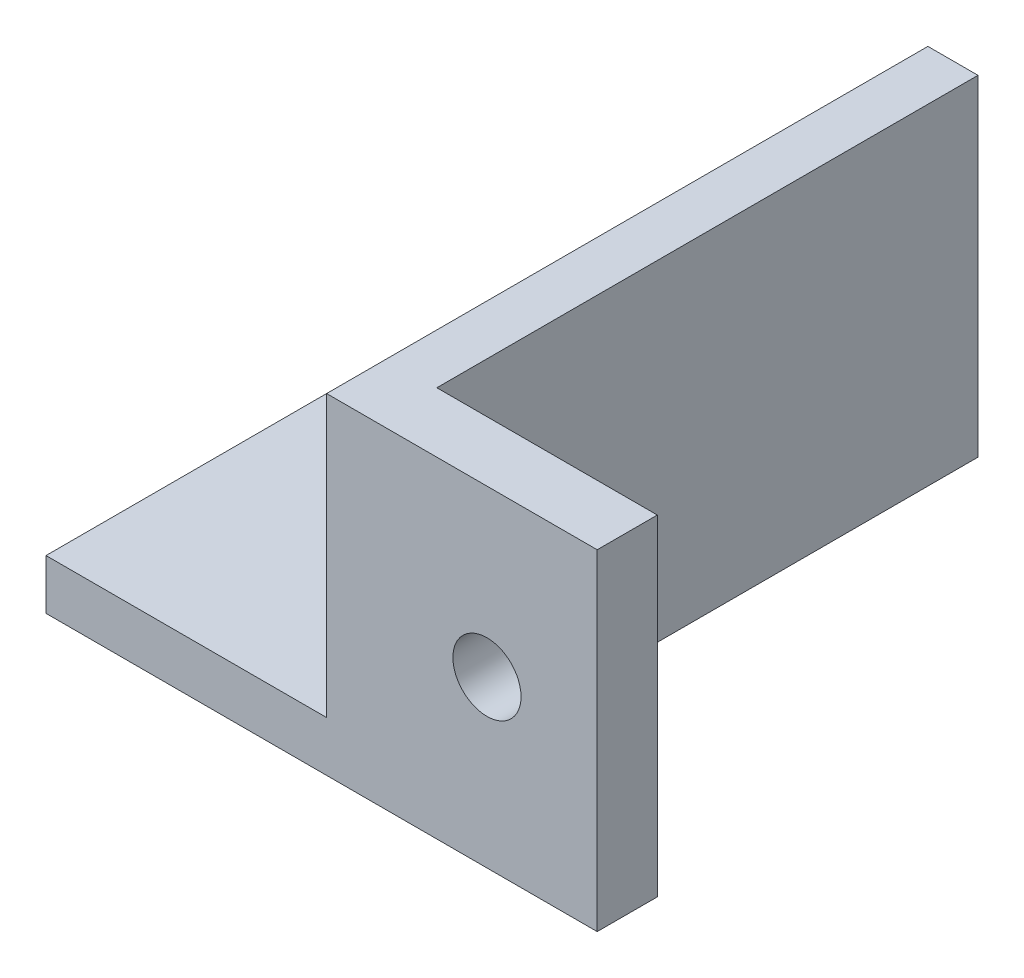
ISO-10303-21;
HEADER;
FILE_DESCRIPTION(('STEP AP214'),'2;1');
FILE_NAME('part.step','',(''),(''),'','','');
FILE_SCHEMA(('AUTOMOTIVE_DESIGN { 1 0 10303 214 1 1 1 1 }'));
ENDSEC;
DATA;
#1=APPLICATION_CONTEXT('core data for automotive mechanical design processes');
#2=APPLICATION_PROTOCOL_DEFINITION('international standard','automotive_design',2000,#1);
#3=PRODUCT_CONTEXT('',#1,'mechanical');
#4=PRODUCT('Part','Part','',(#3));
#5=PRODUCT_RELATED_PRODUCT_CATEGORY('part','',(#4));
#6=PRODUCT_DEFINITION_FORMATION('','',#4);
#7=PRODUCT_DEFINITION_CONTEXT('part definition',#1,'design');
#8=PRODUCT_DEFINITION('design','',#6,#7);
#9=PRODUCT_DEFINITION_SHAPE('','',#8);
#10=(LENGTH_UNIT() NAMED_UNIT(*) SI_UNIT(.MILLI.,.METRE.));
#11=(NAMED_UNIT(*) PLANE_ANGLE_UNIT() SI_UNIT($,.RADIAN.));
#12=(NAMED_UNIT(*) SI_UNIT($,.STERADIAN.) SOLID_ANGLE_UNIT());
#13=UNCERTAINTY_MEASURE_WITH_UNIT(LENGTH_MEASURE(1.E-05),#10,'distance_accuracy_value','');
#14=(GEOMETRIC_REPRESENTATION_CONTEXT(3) GLOBAL_UNCERTAINTY_ASSIGNED_CONTEXT((#13)) GLOBAL_UNIT_ASSIGNED_CONTEXT((#10,
#11,#12)) REPRESENTATION_CONTEXT('',''));
#15=CARTESIAN_POINT('',(0.,0.,0.));
#16=DIRECTION('',(0.,0.,1.));
#17=DIRECTION('',(1.,0.,0.));
#18=AXIS2_PLACEMENT_3D('',#15,#16,#17);
#19=CARTESIAN_POINT('',(82.,-25.5,50.));
#20=DIRECTION('',(1.,0.,0.));
#21=DIRECTION('',(0.,1.,0.));
#22=AXIS2_PLACEMENT_3D('',#19,#20,#21);
#23=PLANE('',#22);
#24=DIRECTION('',(0.,0.,1.));
#25=VECTOR('',#24,1.);
#26=CARTESIAN_POINT('',(82.,-25.5,50.));
#27=LINE('',#26,#25);
#28=CARTESIAN_POINT('',(82.,-25.5,50.));
#29=VERTEX_POINT('',#28);
#30=CARTESIAN_POINT('',(82.,-25.5,77.));
#31=VERTEX_POINT('',#30);
#32=EDGE_CURVE('E171',#29,#31,#27,.T.);
#33=ORIENTED_EDGE('',*,*,#32,.F.);
#34=DIRECTION('',(0.,1.,0.));
#35=VECTOR('',#34,1.);
#36=CARTESIAN_POINT('',(82.,-25.5,50.));
#37=LINE('',#36,#35);
#38=CARTESIAN_POINT('',(82.,-9.,50.));
#39=VERTEX_POINT('',#38);
#40=EDGE_CURVE('E25',#29,#39,#37,.T.);
#41=ORIENTED_EDGE('',*,*,#40,.T.);
#42=DIRECTION('',(0.,0.,1.));
#43=VECTOR('',#42,1.);
#44=CARTESIAN_POINT('',(82.,-9.,50.));
#45=LINE('',#44,#43);
#46=CARTESIAN_POINT('',(82.,-9.,77.));
#47=VERTEX_POINT('',#46);
#48=EDGE_CURVE('E197',#39,#47,#45,.T.);
#49=ORIENTED_EDGE('',*,*,#48,.T.);
#50=DIRECTION('',(0.,1.,0.));
#51=VECTOR('',#50,1.);
#52=CARTESIAN_POINT('',(82.,-25.5,77.));
#53=LINE('',#52,#51);
#54=EDGE_CURVE('E10',#31,#47,#53,.T.);
#55=ORIENTED_EDGE('',*,*,#54,.F.);
#56=EDGE_LOOP('',(#33,#41,#49,#55));
#57=FACE_BOUND('',#56,.T.);
#58=ADVANCED_FACE('F15',(#57),#23,.T.);
#59=CARTESIAN_POINT('',(82.,-25.5,77.));
#60=DIRECTION('',(0.,0.,1.));
#61=DIRECTION('',(1.,0.,0.));
#62=AXIS2_PLACEMENT_3D('',#59,#60,#61);
#63=PLANE('',#62);
#64=CARTESIAN_POINT('',(87.5,-17.25,77.));
#65=DIRECTION('',(0.,0.,1.));
#66=DIRECTION('',(1.,0.,0.));
#67=AXIS2_PLACEMENT_3D('',#64,#65,#66);
#68=CIRCLE('',#67,1.7);
#69=CARTESIAN_POINT('',(89.2,-17.25,77.));
#70=VERTEX_POINT('',#69);
#71=EDGE_CURVE('E36',#70,#70,#68,.T.);
#72=ORIENTED_EDGE('',*,*,#71,.T.);
#73=EDGE_LOOP('',(#72));
#74=FACE_BOUND('',#73,.T.);
#75=DIRECTION('',(1.,0.,0.));
#76=VECTOR('',#75,1.);
#77=CARTESIAN_POINT('',(82.,-9.,77.));
#78=LINE('',#77,#76);
#79=CARTESIAN_POINT('',(93.,-9.,77.));
#80=VERTEX_POINT('',#79);
#81=EDGE_CURVE('E199',#47,#80,#78,.T.);
#82=ORIENTED_EDGE('',*,*,#81,.T.);
#83=DIRECTION('',(0.,1.,0.));
#84=VECTOR('',#83,1.);
#85=CARTESIAN_POINT('',(93.,-25.5,77.));
#86=LINE('',#85,#84);
#87=CARTESIAN_POINT('',(93.,-25.5,77.));
#88=VERTEX_POINT('',#87);
#89=EDGE_CURVE('E114',#88,#80,#86,.T.);
#90=ORIENTED_EDGE('',*,*,#89,.F.);
#91=DIRECTION('',(1.,0.,0.));
#92=VECTOR('',#91,1.);
#93=CARTESIAN_POINT('',(82.,-25.5,77.));
#94=LINE('',#93,#92);
#95=EDGE_CURVE('E130',#31,#88,#94,.T.);
#96=ORIENTED_EDGE('',*,*,#95,.F.);
#97=ORIENTED_EDGE('',*,*,#54,.T.);
#98=EDGE_LOOP('',(#82,#90,#96,#97));
#99=FACE_BOUND('',#98,.T.);
#100=ADVANCED_FACE('F17',(#74,#99),#63,.F.);
#101=CARTESIAN_POINT('',(79.5,-25.5,50.));
#102=DIRECTION('',(0.,0.,1.));
#103=DIRECTION('',(1.,0.,0.));
#104=AXIS2_PLACEMENT_3D('',#101,#102,#103);
#105=PLANE('',#104);
#106=DIRECTION('',(1.,0.,0.));
#107=VECTOR('',#106,1.);
#108=CARTESIAN_POINT('',(65.5,-25.5,50.));
#109=LINE('',#108,#107);
#110=CARTESIAN_POINT('',(65.5,-25.5,50.));
#111=VERTEX_POINT('',#110);
#112=EDGE_CURVE('E98',#111,#29,#109,.T.);
#113=ORIENTED_EDGE('',*,*,#112,.F.);
#114=DIRECTION('',(0.,1.,0.));
#115=VECTOR('',#114,1.);
#116=CARTESIAN_POINT('',(65.5,-25.5,50.));
#117=LINE('',#116,#115);
#118=CARTESIAN_POINT('',(65.5,-23.,50.));
#119=VERTEX_POINT('',#118);
#120=EDGE_CURVE('E166',#111,#119,#117,.T.);
#121=ORIENTED_EDGE('',*,*,#120,.T.);
#122=DIRECTION('',(1.,0.,0.));
#123=VECTOR('',#122,1.);
#124=CARTESIAN_POINT('',(65.5,-23.,50.));
#125=LINE('',#124,#123);
#126=CARTESIAN_POINT('',(79.5,-23.,50.));
#127=VERTEX_POINT('',#126);
#128=EDGE_CURVE('E220',#119,#127,#125,.T.);
#129=ORIENTED_EDGE('',*,*,#128,.T.);
#130=DIRECTION('',(0.,1.,0.));
#131=VECTOR('',#130,1.);
#132=CARTESIAN_POINT('',(79.5,-25.5,50.));
#133=LINE('',#132,#131);
#134=CARTESIAN_POINT('',(79.5,-9.,50.));
#135=VERTEX_POINT('',#134);
#136=EDGE_CURVE('E211',#127,#135,#133,.T.);
#137=ORIENTED_EDGE('',*,*,#136,.T.);
#138=DIRECTION('',(1.,0.,0.));
#139=VECTOR('',#138,1.);
#140=CARTESIAN_POINT('',(79.5,-9.,50.));
#141=LINE('',#140,#139);
#142=EDGE_CURVE('E174',#135,#39,#141,.T.);
#143=ORIENTED_EDGE('',*,*,#142,.T.);
#144=ORIENTED_EDGE('',*,*,#40,.F.);
#145=EDGE_LOOP('',(#113,#121,#129,#137,#143,#144));
#146=FACE_BOUND('',#145,.T.);
#147=ADVANCED_FACE('F242',(#146),#105,.F.);
#148=CARTESIAN_POINT('',(87.5,-17.25,76.8));
#149=DIRECTION('',(0.,0.,1.));
#150=DIRECTION('',(1.,0.,0.));
#151=AXIS2_PLACEMENT_3D('',#148,#149,#150);
#152=CYLINDRICAL_SURFACE('',#151,1.7);
#153=DIRECTION('',(0.,0.,1.));
#154=VECTOR('',#153,1.);
#155=CARTESIAN_POINT('',(89.2,-17.25,76.8));
#156=LINE('',#155,#154);
#157=CARTESIAN_POINT('',(89.2,-17.25,80.));
#158=VERTEX_POINT('',#157);
#159=EDGE_CURVE('E162',#70,#158,#156,.T.);
#160=ORIENTED_EDGE('',*,*,#159,.F.);
#161=ORIENTED_EDGE('',*,*,#71,.F.);
#162=ORIENTED_EDGE('',*,*,#159,.T.);
#163=CARTESIAN_POINT('',(87.5,-17.25,80.));
#164=DIRECTION('',(0.,0.,1.));
#165=DIRECTION('',(1.,0.,0.));
#166=AXIS2_PLACEMENT_3D('',#163,#164,#165);
#167=CIRCLE('',#166,1.7);
#168=EDGE_CURVE('E196',#158,#158,#167,.T.);
#169=ORIENTED_EDGE('',*,*,#168,.T.);
#170=EDGE_LOOP('',(#160,#161,#162,#169));
#171=FACE_BOUND('',#170,.T.);
#172=ADVANCED_FACE('F244',(#171),#152,.F.);
#173=CARTESIAN_POINT('',(79.5,-25.5,50.));
#174=DIRECTION('',(0.,1.,0.));
#175=DIRECTION('',(1.,0.,0.));
#176=AXIS2_PLACEMENT_3D('',#173,#174,#175);
#177=PLANE('',#176);
#178=ORIENTED_EDGE('',*,*,#32,.T.);
#179=ORIENTED_EDGE('',*,*,#95,.T.);
#180=DIRECTION('',(0.,0.,1.));
#181=VECTOR('',#180,1.);
#182=CARTESIAN_POINT('',(93.,-25.5,77.));
#183=LINE('',#182,#181);
#184=CARTESIAN_POINT('',(93.,-25.5,80.));
#185=VERTEX_POINT('',#184);
#186=EDGE_CURVE('E123',#88,#185,#183,.T.);
#187=ORIENTED_EDGE('',*,*,#186,.T.);
#188=DIRECTION('',(1.,0.,0.));
#189=VECTOR('',#188,1.);
#190=CARTESIAN_POINT('',(65.5,-25.5,80.));
#191=LINE('',#190,#189);
#192=CARTESIAN_POINT('',(65.5,-25.5,80.));
#193=VERTEX_POINT('',#192);
#194=EDGE_CURVE('E128',#193,#185,#191,.T.);
#195=ORIENTED_EDGE('',*,*,#194,.F.);
#196=DIRECTION('',(0.,0.,1.));
#197=VECTOR('',#196,1.);
#198=CARTESIAN_POINT('',(65.5,-25.5,50.));
#199=LINE('',#198,#197);
#200=EDGE_CURVE('E132',#111,#193,#199,.T.);
#201=ORIENTED_EDGE('',*,*,#200,.F.);
#202=ORIENTED_EDGE('',*,*,#112,.T.);
#203=EDGE_LOOP('',(#178,#179,#187,#195,#201,#202));
#204=FACE_BOUND('',#203,.T.);
#205=ADVANCED_FACE('F126',(#204),#177,.F.);
#206=CARTESIAN_POINT('',(93.,-25.5,77.));
#207=DIRECTION('',(1.,0.,0.));
#208=DIRECTION('',(0.,1.,0.));
#209=AXIS2_PLACEMENT_3D('',#206,#207,#208);
#210=PLANE('',#209);
#211=ORIENTED_EDGE('',*,*,#186,.F.);
#212=ORIENTED_EDGE('',*,*,#89,.T.);
#213=DIRECTION('',(0.,0.,1.));
#214=VECTOR('',#213,1.);
#215=CARTESIAN_POINT('',(93.,-9.,77.));
#216=LINE('',#215,#214);
#217=CARTESIAN_POINT('',(93.,-9.,80.));
#218=VERTEX_POINT('',#217);
#219=EDGE_CURVE('E138',#80,#218,#216,.T.);
#220=ORIENTED_EDGE('',*,*,#219,.T.);
#221=DIRECTION('',(0.,1.,0.));
#222=VECTOR('',#221,1.);
#223=CARTESIAN_POINT('',(93.,-25.5,80.));
#224=LINE('',#223,#222);
#225=EDGE_CURVE('E135',#185,#218,#224,.T.);
#226=ORIENTED_EDGE('',*,*,#225,.F.);
#227=EDGE_LOOP('',(#211,#212,#220,#226));
#228=FACE_BOUND('',#227,.T.);
#229=ADVANCED_FACE('F136',(#228),#210,.T.);
#230=CARTESIAN_POINT('',(65.5,-25.5,50.));
#231=DIRECTION('',(1.,0.,0.));
#232=DIRECTION('',(0.,1.,0.));
#233=AXIS2_PLACEMENT_3D('',#230,#231,#232);
#234=PLANE('',#233);
#235=DIRECTION('',(0.,1.,0.));
#236=VECTOR('',#235,1.);
#237=CARTESIAN_POINT('',(65.5,-25.5,80.));
#238=LINE('',#237,#236);
#239=CARTESIAN_POINT('',(65.5,-23.,80.));
#240=VERTEX_POINT('',#239);
#241=EDGE_CURVE('E149',#193,#240,#238,.T.);
#242=ORIENTED_EDGE('',*,*,#241,.T.);
#243=DIRECTION('',(0.,0.,1.));
#244=VECTOR('',#243,1.);
#245=CARTESIAN_POINT('',(65.5,-23.,50.));
#246=LINE('',#245,#244);
#247=EDGE_CURVE('E160',#119,#240,#246,.T.);
#248=ORIENTED_EDGE('',*,*,#247,.F.);
#249=ORIENTED_EDGE('',*,*,#120,.F.);
#250=ORIENTED_EDGE('',*,*,#200,.T.);
#251=EDGE_LOOP('',(#242,#248,#249,#250));
#252=FACE_BOUND('',#251,.T.);
#253=ADVANCED_FACE('F241',(#252),#234,.F.);
#254=CARTESIAN_POINT('',(79.5,-9.,50.));
#255=DIRECTION('',(0.,1.,0.));
#256=DIRECTION('',(1.,0.,0.));
#257=AXIS2_PLACEMENT_3D('',#254,#255,#256);
#258=PLANE('',#257);
#259=ORIENTED_EDGE('',*,*,#142,.F.);
#260=DIRECTION('',(0.,0.,1.));
#261=VECTOR('',#260,1.);
#262=CARTESIAN_POINT('',(79.5,-9.,50.));
#263=LINE('',#262,#261);
#264=CARTESIAN_POINT('',(79.5,-9.,80.));
#265=VERTEX_POINT('',#264);
#266=EDGE_CURVE('E192',#135,#265,#263,.T.);
#267=ORIENTED_EDGE('',*,*,#266,.T.);
#268=DIRECTION('',(-1.,0.,0.));
#269=VECTOR('',#268,1.);
#270=CARTESIAN_POINT('',(93.,-9.,80.));
#271=LINE('',#270,#269);
#272=EDGE_CURVE('E143',#218,#265,#271,.T.);
#273=ORIENTED_EDGE('',*,*,#272,.F.);
#274=ORIENTED_EDGE('',*,*,#219,.F.);
#275=ORIENTED_EDGE('',*,*,#81,.F.);
#276=ORIENTED_EDGE('',*,*,#48,.F.);
#277=EDGE_LOOP('',(#259,#267,#273,#274,#275,#276));
#278=FACE_BOUND('',#277,.T.);
#279=ADVANCED_FACE('F230',(#278),#258,.T.);
#280=CARTESIAN_POINT('',(65.5,-23.,50.));
#281=DIRECTION('',(0.,1.,0.));
#282=DIRECTION('',(1.,0.,0.));
#283=AXIS2_PLACEMENT_3D('',#280,#281,#282);
#284=PLANE('',#283);
#285=ORIENTED_EDGE('',*,*,#128,.F.);
#286=ORIENTED_EDGE('',*,*,#247,.T.);
#287=DIRECTION('',(1.,0.,0.));
#288=VECTOR('',#287,1.);
#289=CARTESIAN_POINT('',(65.5,-23.,80.));
#290=LINE('',#289,#288);
#291=CARTESIAN_POINT('',(79.5,-23.,80.));
#292=VERTEX_POINT('',#291);
#293=EDGE_CURVE('E156',#240,#292,#290,.T.);
#294=ORIENTED_EDGE('',*,*,#293,.T.);
#295=DIRECTION('',(0.,0.,1.));
#296=VECTOR('',#295,1.);
#297=CARTESIAN_POINT('',(79.5,-23.,50.));
#298=LINE('',#297,#296);
#299=EDGE_CURVE('E19',#127,#292,#298,.T.);
#300=ORIENTED_EDGE('',*,*,#299,.F.);
#301=EDGE_LOOP('',(#285,#286,#294,#300));
#302=FACE_BOUND('',#301,.T.);
#303=ADVANCED_FACE('F237',(#302),#284,.T.);
#304=CARTESIAN_POINT('',(79.5,-25.5,50.));
#305=DIRECTION('',(1.,0.,0.));
#306=DIRECTION('',(0.,1.,0.));
#307=AXIS2_PLACEMENT_3D('',#304,#305,#306);
#308=PLANE('',#307);
#309=ORIENTED_EDGE('',*,*,#266,.F.);
#310=ORIENTED_EDGE('',*,*,#136,.F.);
#311=ORIENTED_EDGE('',*,*,#299,.T.);
#312=DIRECTION('',(0.,1.,0.));
#313=VECTOR('',#312,1.);
#314=CARTESIAN_POINT('',(79.5,-25.5,80.));
#315=LINE('',#314,#313);
#316=EDGE_CURVE('E167',#292,#265,#315,.T.);
#317=ORIENTED_EDGE('',*,*,#316,.T.);
#318=EDGE_LOOP('',(#309,#310,#311,#317));
#319=FACE_BOUND('',#318,.T.);
#320=ADVANCED_FACE('F233',(#319),#308,.F.);
#321=CARTESIAN_POINT('',(79.5,-25.5,80.));
#322=DIRECTION('',(0.,0.,1.));
#323=DIRECTION('',(1.,0.,0.));
#324=AXIS2_PLACEMENT_3D('',#321,#322,#323);
#325=PLANE('',#324);
#326=ORIENTED_EDGE('',*,*,#168,.F.);
#327=EDGE_LOOP('',(#326));
#328=FACE_BOUND('',#327,.T.);
#329=ORIENTED_EDGE('',*,*,#316,.F.);
#330=ORIENTED_EDGE('',*,*,#293,.F.);
#331=ORIENTED_EDGE('',*,*,#241,.F.);
#332=ORIENTED_EDGE('',*,*,#194,.T.);
#333=ORIENTED_EDGE('',*,*,#225,.T.);
#334=ORIENTED_EDGE('',*,*,#272,.T.);
#335=EDGE_LOOP('',(#329,#330,#331,#332,#333,#334));
#336=FACE_BOUND('',#335,.T.);
#337=ADVANCED_FACE('F146',(#328,#336),#325,.T.);
#338=CLOSED_SHELL('',(#58,#100,#147,#172,#205,#229,#253,#279,#303,#320,#337));
#339=MANIFOLD_SOLID_BREP('B1',#338);
#340=ADVANCED_BREP_SHAPE_REPRESENTATION('',(#18,#339),#14);
#341=SHAPE_DEFINITION_REPRESENTATION(#9,#340);
ENDSEC;
END-ISO-10303-21;
